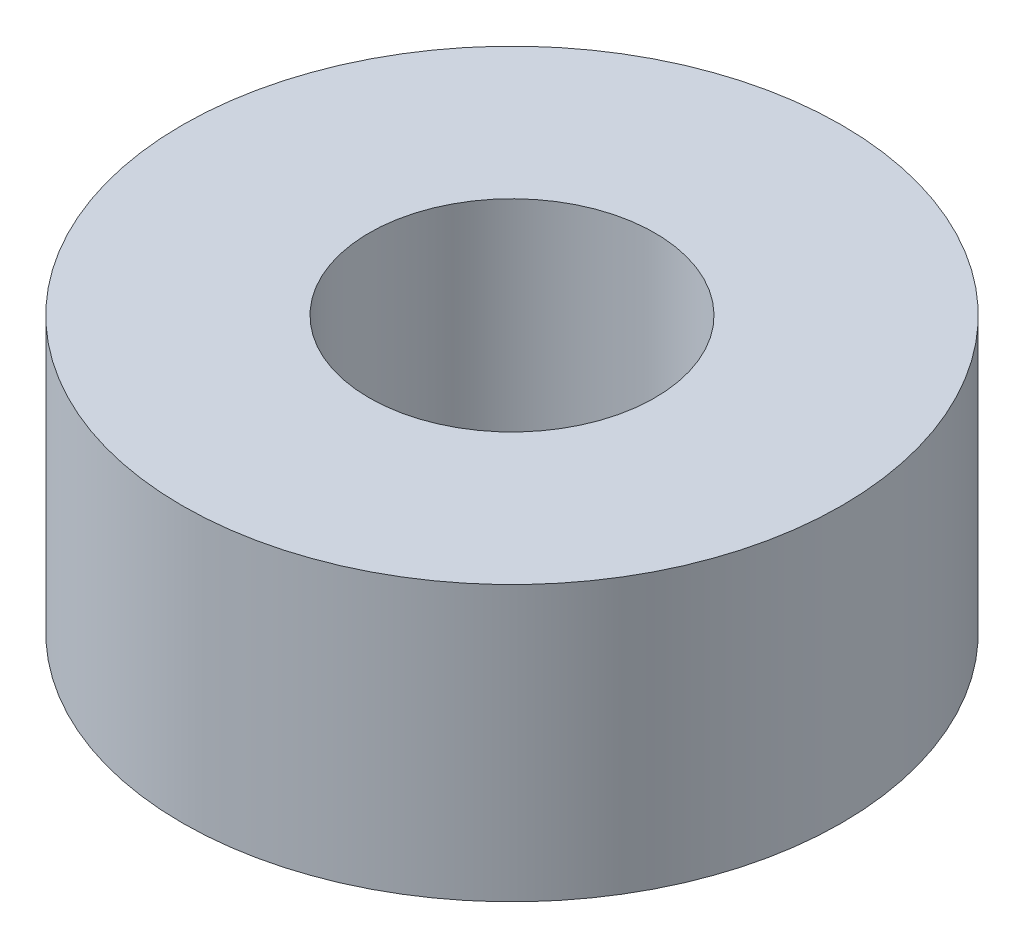
ISO-10303-21;
HEADER;
FILE_DESCRIPTION(('STEP AP214'),'2;1');
FILE_NAME('part.step','',(''),(''),'','','');
FILE_SCHEMA(('AUTOMOTIVE_DESIGN { 1 0 10303 214 1 1 1 1 }'));
ENDSEC;
DATA;
#1=APPLICATION_CONTEXT('core data for automotive mechanical design processes');
#2=APPLICATION_PROTOCOL_DEFINITION('international standard','automotive_design',2000,#1);
#3=PRODUCT_CONTEXT('',#1,'mechanical');
#4=PRODUCT('Part','Part','',(#3));
#5=PRODUCT_RELATED_PRODUCT_CATEGORY('part','',(#4));
#6=PRODUCT_DEFINITION_FORMATION('','',#4);
#7=PRODUCT_DEFINITION_CONTEXT('part definition',#1,'design');
#8=PRODUCT_DEFINITION('design','',#6,#7);
#9=PRODUCT_DEFINITION_SHAPE('','',#8);
#10=(LENGTH_UNIT() NAMED_UNIT(*) SI_UNIT(.MILLI.,.METRE.));
#11=(NAMED_UNIT(*) PLANE_ANGLE_UNIT() SI_UNIT($,.RADIAN.));
#12=(NAMED_UNIT(*) SI_UNIT($,.STERADIAN.) SOLID_ANGLE_UNIT());
#13=UNCERTAINTY_MEASURE_WITH_UNIT(LENGTH_MEASURE(1.E-05),#10,'distance_accuracy_value','');
#14=(GEOMETRIC_REPRESENTATION_CONTEXT(3) GLOBAL_UNCERTAINTY_ASSIGNED_CONTEXT((#13)) GLOBAL_UNIT_ASSIGNED_CONTEXT((#10,
#11,#12)) REPRESENTATION_CONTEXT('',''));
#15=CARTESIAN_POINT('',(0.,0.,0.));
#16=DIRECTION('',(0.,0.,1.));
#17=DIRECTION('',(1.,0.,0.));
#18=AXIS2_PLACEMENT_3D('',#15,#16,#17);
#19=CARTESIAN_POINT('',(0.,5.,0.));
#20=DIRECTION('',(0.,1.,0.));
#21=DIRECTION('',(0.,0.,1.));
#22=AXIS2_PLACEMENT_3D('',#19,#20,#21);
#23=PLANE('',#22);
#24=CARTESIAN_POINT('',(0.,5.,0.));
#25=DIRECTION('',(0.,1.,0.));
#26=DIRECTION('',(0.,0.,1.));
#27=AXIS2_PLACEMENT_3D('',#24,#25,#26);
#28=CIRCLE('',#27,6.);
#29=CARTESIAN_POINT('',(0.,5.,6.));
#30=VERTEX_POINT('',#29);
#31=EDGE_CURVE('E10',#30,#30,#28,.T.);
#32=ORIENTED_EDGE('',*,*,#31,.T.);
#33=EDGE_LOOP('',(#32));
#34=FACE_BOUND('',#33,.T.);
#35=CARTESIAN_POINT('',(0.,5.,0.));
#36=DIRECTION('',(0.,1.,0.));
#37=DIRECTION('',(0.,0.,1.));
#38=AXIS2_PLACEMENT_3D('',#35,#36,#37);
#39=CIRCLE('',#38,2.6);
#40=CARTESIAN_POINT('',(0.,5.,2.6));
#41=VERTEX_POINT('',#40);
#42=EDGE_CURVE('E50',#41,#41,#39,.T.);
#43=ORIENTED_EDGE('',*,*,#42,.F.);
#44=EDGE_LOOP('',(#43));
#45=FACE_BOUND('',#44,.T.);
#46=ADVANCED_FACE('F39',(#34,#45),#23,.T.);
#47=CARTESIAN_POINT('',(0.,0.,0.));
#48=DIRECTION('',(0.,1.,0.));
#49=DIRECTION('',(0.,0.,1.));
#50=AXIS2_PLACEMENT_3D('',#47,#48,#49);
#51=PLANE('',#50);
#52=CARTESIAN_POINT('',(0.,0.,0.));
#53=DIRECTION('',(0.,1.,0.));
#54=DIRECTION('',(0.,0.,1.));
#55=AXIS2_PLACEMENT_3D('',#52,#53,#54);
#56=CIRCLE('',#55,6.);
#57=CARTESIAN_POINT('',(0.,0.,6.));
#58=VERTEX_POINT('',#57);
#59=EDGE_CURVE('E43',#58,#58,#56,.T.);
#60=ORIENTED_EDGE('',*,*,#59,.F.);
#61=EDGE_LOOP('',(#60));
#62=FACE_BOUND('',#61,.T.);
#63=CARTESIAN_POINT('',(0.,0.,0.));
#64=DIRECTION('',(0.,1.,0.));
#65=DIRECTION('',(0.,0.,1.));
#66=AXIS2_PLACEMENT_3D('',#63,#64,#65);
#67=CIRCLE('',#66,2.6);
#68=CARTESIAN_POINT('',(0.,0.,2.6));
#69=VERTEX_POINT('',#68);
#70=EDGE_CURVE('E52',#69,#69,#67,.T.);
#71=ORIENTED_EDGE('',*,*,#70,.T.);
#72=EDGE_LOOP('',(#71));
#73=FACE_BOUND('',#72,.T.);
#74=ADVANCED_FACE('F62',(#62,#73),#51,.F.);
#75=CARTESIAN_POINT('',(0.,5.,0.));
#76=DIRECTION('',(0.,-1.,0.));
#77=DIRECTION('',(0.,0.,-1.));
#78=AXIS2_PLACEMENT_3D('',#75,#76,#77);
#79=CYLINDRICAL_SURFACE('',#78,6.);
#80=ORIENTED_EDGE('',*,*,#31,.F.);
#81=EDGE_LOOP('',(#80));
#82=FACE_BOUND('',#81,.T.);
#83=ORIENTED_EDGE('',*,*,#59,.T.);
#84=EDGE_LOOP('',(#83));
#85=FACE_BOUND('',#84,.T.);
#86=ADVANCED_FACE('F41',(#82,#85),#79,.T.);
#87=CARTESIAN_POINT('',(0.,5.,0.));
#88=DIRECTION('',(0.,-1.,0.));
#89=DIRECTION('',(0.,0.,-1.));
#90=AXIS2_PLACEMENT_3D('',#87,#88,#89);
#91=CYLINDRICAL_SURFACE('',#90,2.6);
#92=ORIENTED_EDGE('',*,*,#42,.T.);
#93=EDGE_LOOP('',(#92));
#94=FACE_BOUND('',#93,.T.);
#95=ORIENTED_EDGE('',*,*,#70,.F.);
#96=EDGE_LOOP('',(#95));
#97=FACE_BOUND('',#96,.T.);
#98=ADVANCED_FACE('F58',(#94,#97),#91,.F.);
#99=CLOSED_SHELL('',(#46,#74,#86,#98));
#100=MANIFOLD_SOLID_BREP('B2',#99);
#101=ADVANCED_BREP_SHAPE_REPRESENTATION('',(#18,#100),#14);
#102=SHAPE_DEFINITION_REPRESENTATION(#9,#101);
ENDSEC;
END-ISO-10303-21;
